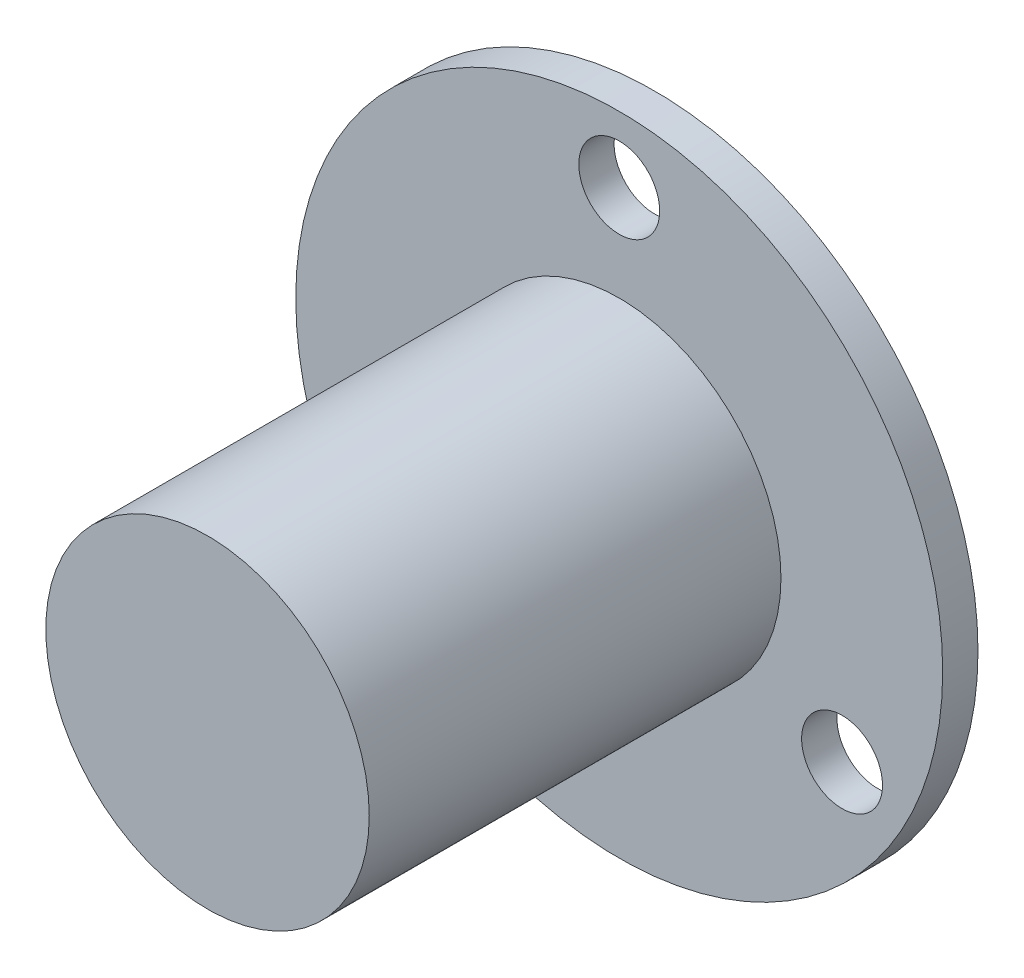
ISO-10303-21;
HEADER;
FILE_DESCRIPTION(('STEP AP214'),'2;1');
FILE_NAME('part.step','',(''),(''),'','','');
FILE_SCHEMA(('AUTOMOTIVE_DESIGN { 1 0 10303 214 1 1 1 1 }'));
ENDSEC;
DATA;
#1=APPLICATION_CONTEXT('core data for automotive mechanical design processes');
#2=APPLICATION_PROTOCOL_DEFINITION('international standard','automotive_design',2000,#1);
#3=PRODUCT_CONTEXT('',#1,'mechanical');
#4=PRODUCT('Part','Part','',(#3));
#5=PRODUCT_RELATED_PRODUCT_CATEGORY('part','',(#4));
#6=PRODUCT_DEFINITION_FORMATION('','',#4);
#7=PRODUCT_DEFINITION_CONTEXT('part definition',#1,'design');
#8=PRODUCT_DEFINITION('design','',#6,#7);
#9=PRODUCT_DEFINITION_SHAPE('','',#8);
#10=(LENGTH_UNIT() NAMED_UNIT(*) SI_UNIT(.MILLI.,.METRE.));
#11=(NAMED_UNIT(*) PLANE_ANGLE_UNIT() SI_UNIT($,.RADIAN.));
#12=(NAMED_UNIT(*) SI_UNIT($,.STERADIAN.) SOLID_ANGLE_UNIT());
#13=UNCERTAINTY_MEASURE_WITH_UNIT(LENGTH_MEASURE(1.E-05),#10,'distance_accuracy_value','');
#14=(GEOMETRIC_REPRESENTATION_CONTEXT(3) GLOBAL_UNCERTAINTY_ASSIGNED_CONTEXT((#13)) GLOBAL_UNIT_ASSIGNED_CONTEXT((#10,
#11,#12)) REPRESENTATION_CONTEXT('',''));
#15=CARTESIAN_POINT('',(0.,0.,0.));
#16=DIRECTION('',(0.,0.,1.));
#17=DIRECTION('',(1.,0.,0.));
#18=AXIS2_PLACEMENT_3D('',#15,#16,#17);
#19=CARTESIAN_POINT('',(0.,0.,2.4));
#20=DIRECTION('',(0.,0.,1.));
#21=DIRECTION('',(1.,0.,0.));
#22=AXIS2_PLACEMENT_3D('',#19,#20,#21);
#23=PLANE('',#22);
#24=CARTESIAN_POINT('',(0.,0.,2.4));
#25=DIRECTION('',(0.,0.,1.));
#26=DIRECTION('',(1.,0.,0.));
#27=AXIS2_PLACEMENT_3D('',#24,#25,#26);
#28=CIRCLE('',#27,11.);
#29=CARTESIAN_POINT('',(11.,0.,2.4));
#30=VERTEX_POINT('',#29);
#31=EDGE_CURVE('E82',#30,#30,#28,.T.);
#32=ORIENTED_EDGE('',*,*,#31,.F.);
#33=EDGE_LOOP('',(#32));
#34=FACE_BOUND('',#33,.T.);
#35=CARTESIAN_POINT('',(15.1554445662277,-8.74999999999935,2.4));
#36=DIRECTION('',(0.,0.,1.));
#37=DIRECTION('',(1.,0.,0.));
#38=AXIS2_PLACEMENT_3D('',#35,#36,#37);
#39=CIRCLE('',#38,2.75000000000071);
#40=CARTESIAN_POINT('',(17.9054445662284,-8.74999999999935,2.4));
#41=VERTEX_POINT('',#40);
#42=EDGE_CURVE('E62',#41,#41,#39,.T.);
#43=ORIENTED_EDGE('',*,*,#42,.F.);
#44=EDGE_LOOP('',(#43));
#45=FACE_BOUND('',#44,.T.);
#46=CARTESIAN_POINT('',(0.,0.,2.4));
#47=DIRECTION('',(0.,0.,1.));
#48=DIRECTION('',(1.,0.,0.));
#49=AXIS2_PLACEMENT_3D('',#46,#47,#48);
#50=CIRCLE('',#49,22.);
#51=CARTESIAN_POINT('',(22.,0.,2.4));
#52=VERTEX_POINT('',#51);
#53=EDGE_CURVE('E45',#52,#52,#50,.T.);
#54=ORIENTED_EDGE('',*,*,#53,.T.);
#55=EDGE_LOOP('',(#54));
#56=FACE_BOUND('',#55,.T.);
#57=CARTESIAN_POINT('',(0.,17.5,2.4));
#58=DIRECTION('',(0.,0.,1.));
#59=DIRECTION('',(1.,0.,0.));
#60=AXIS2_PLACEMENT_3D('',#57,#58,#59);
#61=CIRCLE('',#60,2.75);
#62=CARTESIAN_POINT('',(2.75,17.5,2.4));
#63=VERTEX_POINT('',#62);
#64=EDGE_CURVE('E56',#63,#63,#61,.T.);
#65=ORIENTED_EDGE('',*,*,#64,.F.);
#66=EDGE_LOOP('',(#65));
#67=FACE_BOUND('',#66,.T.);
#68=CARTESIAN_POINT('',(-15.1554445662271,-8.74999999999967,2.4));
#69=DIRECTION('',(0.,0.,1.));
#70=DIRECTION('',(1.,0.,0.));
#71=AXIS2_PLACEMENT_3D('',#68,#69,#70);
#72=CIRCLE('',#71,2.75000000000033);
#73=CARTESIAN_POINT('',(-12.4054445662268,-8.74999999999967,2.4));
#74=VERTEX_POINT('',#73);
#75=EDGE_CURVE('E70',#74,#74,#72,.T.);
#76=ORIENTED_EDGE('',*,*,#75,.F.);
#77=EDGE_LOOP('',(#76));
#78=FACE_BOUND('',#77,.T.);
#79=ADVANCED_FACE('F37',(#34,#45,#56,#67,#78),#23,.T.);
#80=CARTESIAN_POINT('',(0.,0.,0.));
#81=DIRECTION('',(0.,0.,1.));
#82=DIRECTION('',(1.,0.,0.));
#83=AXIS2_PLACEMENT_3D('',#80,#81,#82);
#84=PLANE('',#83);
#85=CARTESIAN_POINT('',(0.,0.,0.));
#86=DIRECTION('',(0.,0.,1.));
#87=DIRECTION('',(1.,0.,0.));
#88=AXIS2_PLACEMENT_3D('',#85,#86,#87);
#89=CIRCLE('',#88,3.9);
#90=CARTESIAN_POINT('',(3.9,0.,0.));
#91=VERTEX_POINT('',#90);
#92=EDGE_CURVE('E10',#91,#91,#89,.F.);
#93=ORIENTED_EDGE('',*,*,#92,.F.);
#94=EDGE_LOOP('',(#93));
#95=FACE_BOUND('',#94,.T.);
#96=CARTESIAN_POINT('',(0.,0.,0.));
#97=DIRECTION('',(0.,0.,1.));
#98=DIRECTION('',(1.,0.,0.));
#99=AXIS2_PLACEMENT_3D('',#96,#97,#98);
#100=CIRCLE('',#99,22.);
#101=CARTESIAN_POINT('',(22.,0.,0.));
#102=VERTEX_POINT('',#101);
#103=EDGE_CURVE('E50',#102,#102,#100,.T.);
#104=ORIENTED_EDGE('',*,*,#103,.F.);
#105=EDGE_LOOP('',(#104));
#106=FACE_BOUND('',#105,.T.);
#107=CARTESIAN_POINT('',(0.,17.5,0.));
#108=DIRECTION('',(0.,0.,1.));
#109=DIRECTION('',(1.,0.,0.));
#110=AXIS2_PLACEMENT_3D('',#107,#108,#109);
#111=CIRCLE('',#110,2.75);
#112=CARTESIAN_POINT('',(2.75,17.5,0.));
#113=VERTEX_POINT('',#112);
#114=EDGE_CURVE('E58',#113,#113,#111,.T.);
#115=ORIENTED_EDGE('',*,*,#114,.T.);
#116=EDGE_LOOP('',(#115));
#117=FACE_BOUND('',#116,.T.);
#118=CARTESIAN_POINT('',(15.1554445662277,-8.74999999999935,0.));
#119=DIRECTION('',(0.,0.,1.));
#120=DIRECTION('',(1.,0.,0.));
#121=AXIS2_PLACEMENT_3D('',#118,#119,#120);
#122=CIRCLE('',#121,2.75000000000071);
#123=CARTESIAN_POINT('',(17.9054445662284,-8.74999999999935,0.));
#124=VERTEX_POINT('',#123);
#125=EDGE_CURVE('E66',#124,#124,#122,.T.);
#126=ORIENTED_EDGE('',*,*,#125,.T.);
#127=EDGE_LOOP('',(#126));
#128=FACE_BOUND('',#127,.T.);
#129=CARTESIAN_POINT('',(-15.1554445662271,-8.74999999999967,0.));
#130=DIRECTION('',(0.,0.,1.));
#131=DIRECTION('',(1.,0.,0.));
#132=AXIS2_PLACEMENT_3D('',#129,#130,#131);
#133=CIRCLE('',#132,2.75000000000033);
#134=CARTESIAN_POINT('',(-12.4054445662268,-8.74999999999967,0.));
#135=VERTEX_POINT('',#134);
#136=EDGE_CURVE('E74',#135,#135,#133,.T.);
#137=ORIENTED_EDGE('',*,*,#136,.T.);
#138=EDGE_LOOP('',(#137));
#139=FACE_BOUND('',#138,.T.);
#140=ADVANCED_FACE('F109',(#95,#106,#117,#128,#139),#84,.F.);
#141=CARTESIAN_POINT('',(0.,0.,2.4));
#142=DIRECTION('',(0.,0.,-1.));
#143=DIRECTION('',(-1.,0.,0.));
#144=AXIS2_PLACEMENT_3D('',#141,#142,#143);
#145=CYLINDRICAL_SURFACE('',#144,22.);
#146=ORIENTED_EDGE('',*,*,#53,.F.);
#147=EDGE_LOOP('',(#146));
#148=FACE_BOUND('',#147,.T.);
#149=ORIENTED_EDGE('',*,*,#103,.T.);
#150=EDGE_LOOP('',(#149));
#151=FACE_BOUND('',#150,.T.);
#152=ADVANCED_FACE('F39',(#148,#151),#145,.T.);
#153=CARTESIAN_POINT('',(0.,17.5,2.4));
#154=DIRECTION('',(0.,0.,-1.));
#155=DIRECTION('',(-1.,0.,0.));
#156=AXIS2_PLACEMENT_3D('',#153,#154,#155);
#157=CYLINDRICAL_SURFACE('',#156,2.75);
#158=ORIENTED_EDGE('',*,*,#64,.T.);
#159=EDGE_LOOP('',(#158));
#160=FACE_BOUND('',#159,.T.);
#161=ORIENTED_EDGE('',*,*,#114,.F.);
#162=EDGE_LOOP('',(#161));
#163=FACE_BOUND('',#162,.T.);
#164=ADVANCED_FACE('F119',(#160,#163),#157,.F.);
#165=CARTESIAN_POINT('',(15.1554445662277,-8.74999999999935,2.4));
#166=DIRECTION('',(0.,0.,-1.));
#167=DIRECTION('',(-1.,0.,0.));
#168=AXIS2_PLACEMENT_3D('',#165,#166,#167);
#169=CYLINDRICAL_SURFACE('',#168,2.75000000000071);
#170=ORIENTED_EDGE('',*,*,#42,.T.);
#171=EDGE_LOOP('',(#170));
#172=FACE_BOUND('',#171,.T.);
#173=ORIENTED_EDGE('',*,*,#125,.F.);
#174=EDGE_LOOP('',(#173));
#175=FACE_BOUND('',#174,.T.);
#176=ADVANCED_FACE('F122',(#172,#175),#169,.F.);
#177=CARTESIAN_POINT('',(-15.1554445662271,-8.74999999999967,2.4));
#178=DIRECTION('',(0.,0.,-1.));
#179=DIRECTION('',(-1.,0.,0.));
#180=AXIS2_PLACEMENT_3D('',#177,#178,#179);
#181=CYLINDRICAL_SURFACE('',#180,2.75000000000033);
#182=ORIENTED_EDGE('',*,*,#75,.T.);
#183=EDGE_LOOP('',(#182));
#184=FACE_BOUND('',#183,.T.);
#185=ORIENTED_EDGE('',*,*,#136,.F.);
#186=EDGE_LOOP('',(#185));
#187=FACE_BOUND('',#186,.T.);
#188=ADVANCED_FACE('F126',(#184,#187),#181,.F.);
#189=CARTESIAN_POINT('',(0.,0.,30.4));
#190=DIRECTION('',(0.,0.,-1.));
#191=DIRECTION('',(-1.,0.,0.));
#192=AXIS2_PLACEMENT_3D('',#189,#190,#191);
#193=CYLINDRICAL_SURFACE('',#192,11.);
#194=CARTESIAN_POINT('',(0.,0.,30.4));
#195=DIRECTION('',(0.,0.,1.));
#196=DIRECTION('',(1.,0.,0.));
#197=AXIS2_PLACEMENT_3D('',#194,#195,#196);
#198=CIRCLE('',#197,11.);
#199=CARTESIAN_POINT('',(11.,0.,30.4));
#200=VERTEX_POINT('',#199);
#201=EDGE_CURVE('E78',#200,#200,#198,.T.);
#202=ORIENTED_EDGE('',*,*,#201,.F.);
#203=EDGE_LOOP('',(#202));
#204=FACE_BOUND('',#203,.T.);
#205=ORIENTED_EDGE('',*,*,#31,.T.);
#206=EDGE_LOOP('',(#205));
#207=FACE_BOUND('',#206,.T.);
#208=ADVANCED_FACE('F105',(#204,#207),#193,.T.);
#209=CARTESIAN_POINT('',(0.,0.,30.4));
#210=DIRECTION('',(0.,0.,1.));
#211=DIRECTION('',(1.,0.,0.));
#212=AXIS2_PLACEMENT_3D('',#209,#210,#211);
#213=PLANE('',#212);
#214=ORIENTED_EDGE('',*,*,#201,.T.);
#215=EDGE_LOOP('',(#214));
#216=FACE_BOUND('',#215,.T.);
#217=ADVANCED_FACE('F98',(#216),#213,.T.);
#218=CARTESIAN_POINT('',(0.,0.,-9.));
#219=DIRECTION('',(0.,0.,1.));
#220=DIRECTION('',(1.,0.,0.));
#221=AXIS2_PLACEMENT_3D('',#218,#219,#220);
#222=CYLINDRICAL_SURFACE('',#221,3.9);
#223=CARTESIAN_POINT('',(0.,0.,-9.));
#224=DIRECTION('',(0.,0.,-1.));
#225=DIRECTION('',(-1.,0.,0.));
#226=AXIS2_PLACEMENT_3D('',#223,#224,#225);
#227=CIRCLE('',#226,3.9);
#228=CARTESIAN_POINT('',(-3.9,0.,-9.));
#229=VERTEX_POINT('',#228);
#230=EDGE_CURVE('E86',#229,#229,#227,.T.);
#231=ORIENTED_EDGE('',*,*,#230,.F.);
#232=EDGE_LOOP('',(#231));
#233=FACE_BOUND('',#232,.T.);
#234=ORIENTED_EDGE('',*,*,#92,.T.);
#235=EDGE_LOOP('',(#234));
#236=FACE_BOUND('',#235,.T.);
#237=ADVANCED_FACE('F96',(#233,#236),#222,.T.);
#238=CARTESIAN_POINT('',(0.,0.,-9.));
#239=DIRECTION('',(0.,0.,-1.));
#240=DIRECTION('',(-1.,0.,0.));
#241=AXIS2_PLACEMENT_3D('',#238,#239,#240);
#242=PLANE('',#241);
#243=ORIENTED_EDGE('',*,*,#230,.T.);
#244=EDGE_LOOP('',(#243));
#245=FACE_BOUND('',#244,.T.);
#246=ADVANCED_FACE('F94',(#245),#242,.T.);
#247=CLOSED_SHELL('',(#79,#140,#152,#164,#176,#188,#208,#217,#237,#246));
#248=MANIFOLD_SOLID_BREP('B2',#247);
#249=ADVANCED_BREP_SHAPE_REPRESENTATION('',(#18,#248),#14);
#250=SHAPE_DEFINITION_REPRESENTATION(#9,#249);
ENDSEC;
END-ISO-10303-21;
